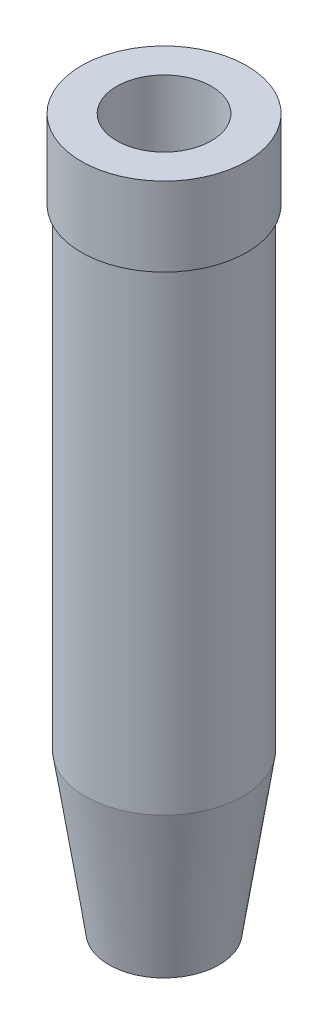
ISO-10303-21;
HEADER;
FILE_DESCRIPTION(('STEP AP214'),'2;1');
FILE_NAME('part.step','',(''),(''),'','','');
FILE_SCHEMA(('AUTOMOTIVE_DESIGN { 1 0 10303 214 1 1 1 1 }'));
ENDSEC;
DATA;
#1=APPLICATION_CONTEXT('core data for automotive mechanical design processes');
#2=APPLICATION_PROTOCOL_DEFINITION('international standard','automotive_design',2000,#1);
#3=PRODUCT_CONTEXT('',#1,'mechanical');
#4=PRODUCT('Part','Part','',(#3));
#5=PRODUCT_RELATED_PRODUCT_CATEGORY('part','',(#4));
#6=PRODUCT_DEFINITION_FORMATION('','',#4);
#7=PRODUCT_DEFINITION_CONTEXT('part definition',#1,'design');
#8=PRODUCT_DEFINITION('design','',#6,#7);
#9=PRODUCT_DEFINITION_SHAPE('','',#8);
#10=(LENGTH_UNIT() NAMED_UNIT(*) SI_UNIT(.MILLI.,.METRE.));
#11=(NAMED_UNIT(*) PLANE_ANGLE_UNIT() SI_UNIT($,.RADIAN.));
#12=(NAMED_UNIT(*) SI_UNIT($,.STERADIAN.) SOLID_ANGLE_UNIT());
#13=UNCERTAINTY_MEASURE_WITH_UNIT(LENGTH_MEASURE(1.E-05),#10,'distance_accuracy_value','');
#14=(GEOMETRIC_REPRESENTATION_CONTEXT(3) GLOBAL_UNCERTAINTY_ASSIGNED_CONTEXT((#13)) GLOBAL_UNIT_ASSIGNED_CONTEXT((#10,
#11,#12)) REPRESENTATION_CONTEXT('',''));
#15=CARTESIAN_POINT('',(0.,0.,0.));
#16=DIRECTION('',(0.,0.,1.));
#17=DIRECTION('',(1.,0.,0.));
#18=AXIS2_PLACEMENT_3D('',#15,#16,#17);
#19=CARTESIAN_POINT('',(3.5,0.,0.));
#20=DIRECTION('',(0.,-1.,0.));
#21=DIRECTION('',(0.,0.,-1.));
#22=AXIS2_PLACEMENT_3D('',#19,#20,#21);
#23=PLANE('',#22);
#24=CARTESIAN_POINT('',(0.,0.,0.));
#25=DIRECTION('',(0.,-1.,0.));
#26=DIRECTION('',(0.,0.,-1.));
#27=AXIS2_PLACEMENT_3D('',#24,#25,#26);
#28=CIRCLE('',#27,3.5);
#29=CARTESIAN_POINT('',(0.,0.,-3.5));
#30=VERTEX_POINT('',#29);
#31=EDGE_CURVE('E70',#30,#30,#28,.T.);
#32=ORIENTED_EDGE('',*,*,#31,.T.);
#33=EDGE_LOOP('',(#32));
#34=FACE_BOUND('',#33,.T.);
#35=CARTESIAN_POINT('',(0.,0.,0.));
#36=DIRECTION('',(0.,-1.,0.));
#37=DIRECTION('',(0.,0.,-1.));
#38=AXIS2_PLACEMENT_3D('',#35,#36,#37);
#39=CIRCLE('',#38,3.);
#40=CARTESIAN_POINT('',(0.,0.,-3.));
#41=VERTEX_POINT('',#40);
#42=EDGE_CURVE('E10',#41,#41,#39,.T.);
#43=ORIENTED_EDGE('',*,*,#42,.F.);
#44=EDGE_LOOP('',(#43));
#45=FACE_BOUND('',#44,.T.);
#46=ADVANCED_FACE('F39',(#34,#45),#23,.T.);
#47=CARTESIAN_POINT('',(0.,0.,0.));
#48=DIRECTION('',(0.,-1.,0.));
#49=DIRECTION('',(0.,0.,-1.));
#50=AXIS2_PLACEMENT_3D('',#47,#48,#49);
#51=CYLINDRICAL_SURFACE('',#50,3.);
#52=ORIENTED_EDGE('',*,*,#42,.T.);
#53=EDGE_LOOP('',(#52));
#54=FACE_BOUND('',#53,.T.);
#55=CARTESIAN_POINT('',(0.,45.,0.));
#56=DIRECTION('',(0.,-1.,0.));
#57=DIRECTION('',(0.,0.,-1.));
#58=AXIS2_PLACEMENT_3D('',#55,#56,#57);
#59=CIRCLE('',#58,3.);
#60=CARTESIAN_POINT('',(0.,45.,-3.));
#61=VERTEX_POINT('',#60);
#62=EDGE_CURVE('E46',#61,#61,#59,.T.);
#63=ORIENTED_EDGE('',*,*,#62,.F.);
#64=EDGE_LOOP('',(#63));
#65=FACE_BOUND('',#64,.T.);
#66=ADVANCED_FACE('F89',(#54,#65),#51,.F.);
#67=CARTESIAN_POINT('',(3.,45.,0.));
#68=DIRECTION('',(0.,1.,0.));
#69=DIRECTION('',(0.,0.,1.));
#70=AXIS2_PLACEMENT_3D('',#67,#68,#69);
#71=PLANE('',#70);
#72=ORIENTED_EDGE('',*,*,#62,.T.);
#73=EDGE_LOOP('',(#72));
#74=FACE_BOUND('',#73,.T.);
#75=CARTESIAN_POINT('',(0.,45.,0.));
#76=DIRECTION('',(0.,-1.,0.));
#77=DIRECTION('',(0.,0.,-1.));
#78=AXIS2_PLACEMENT_3D('',#75,#76,#77);
#79=CIRCLE('',#78,5.25);
#80=CARTESIAN_POINT('',(0.,45.,-5.25));
#81=VERTEX_POINT('',#80);
#82=EDGE_CURVE('E51',#81,#81,#79,.T.);
#83=ORIENTED_EDGE('',*,*,#82,.F.);
#84=EDGE_LOOP('',(#83));
#85=FACE_BOUND('',#84,.T.);
#86=ADVANCED_FACE('F93',(#74,#85),#71,.T.);
#87=CARTESIAN_POINT('',(0.,0.,0.));
#88=DIRECTION('',(0.,-1.,0.));
#89=DIRECTION('',(0.,0.,-1.));
#90=AXIS2_PLACEMENT_3D('',#87,#88,#89);
#91=CYLINDRICAL_SURFACE('',#90,5.25);
#92=ORIENTED_EDGE('',*,*,#82,.T.);
#93=EDGE_LOOP('',(#92));
#94=FACE_BOUND('',#93,.T.);
#95=CARTESIAN_POINT('',(0.,40.,0.));
#96=DIRECTION('',(0.,-1.,0.));
#97=DIRECTION('',(0.,0.,-1.));
#98=AXIS2_PLACEMENT_3D('',#95,#96,#97);
#99=CIRCLE('',#98,5.25);
#100=CARTESIAN_POINT('',(0.,40.,-5.25));
#101=VERTEX_POINT('',#100);
#102=EDGE_CURVE('E56',#101,#101,#99,.T.);
#103=ORIENTED_EDGE('',*,*,#102,.F.);
#104=EDGE_LOOP('',(#103));
#105=FACE_BOUND('',#104,.T.);
#106=ADVANCED_FACE('F97',(#94,#105),#91,.T.);
#107=CARTESIAN_POINT('',(5.25,40.,0.));
#108=DIRECTION('',(0.,-1.,0.));
#109=DIRECTION('',(0.,0.,-1.));
#110=AXIS2_PLACEMENT_3D('',#107,#108,#109);
#111=PLANE('',#110);
#112=ORIENTED_EDGE('',*,*,#102,.T.);
#113=EDGE_LOOP('',(#112));
#114=FACE_BOUND('',#113,.T.);
#115=CARTESIAN_POINT('',(0.,40.,0.));
#116=DIRECTION('',(0.,-1.,0.));
#117=DIRECTION('',(0.,0.,-1.));
#118=AXIS2_PLACEMENT_3D('',#115,#116,#117);
#119=CIRCLE('',#118,5.);
#120=CARTESIAN_POINT('',(0.,40.,-5.));
#121=VERTEX_POINT('',#120);
#122=EDGE_CURVE('E62',#121,#121,#119,.T.);
#123=ORIENTED_EDGE('',*,*,#122,.F.);
#124=EDGE_LOOP('',(#123));
#125=FACE_BOUND('',#124,.T.);
#126=ADVANCED_FACE('F85',(#114,#125),#111,.T.);
#127=CARTESIAN_POINT('',(0.,0.,0.));
#128=DIRECTION('',(0.,-1.,0.));
#129=DIRECTION('',(0.,0.,-1.));
#130=AXIS2_PLACEMENT_3D('',#127,#128,#129);
#131=CYLINDRICAL_SURFACE('',#130,5.);
#132=ORIENTED_EDGE('',*,*,#122,.T.);
#133=EDGE_LOOP('',(#132));
#134=FACE_BOUND('',#133,.T.);
#135=CARTESIAN_POINT('',(0.,10.,0.));
#136=DIRECTION('',(0.,-1.,0.));
#137=DIRECTION('',(0.,0.,-1.));
#138=AXIS2_PLACEMENT_3D('',#135,#136,#137);
#139=CIRCLE('',#138,5.);
#140=CARTESIAN_POINT('',(0.,10.,-5.));
#141=VERTEX_POINT('',#140);
#142=EDGE_CURVE('E66',#141,#141,#139,.T.);
#143=ORIENTED_EDGE('',*,*,#142,.F.);
#144=EDGE_LOOP('',(#143));
#145=FACE_BOUND('',#144,.T.);
#146=ADVANCED_FACE('F79',(#134,#145),#131,.T.);
#147=CARTESIAN_POINT('',(0.,0.,0.));
#148=DIRECTION('',(0.,1.,0.));
#149=DIRECTION('',(0.,0.,1.));
#150=AXIS2_PLACEMENT_3D('',#147,#148,#149);
#151=CONICAL_SURFACE('',#150,3.5,0.148889947609498);
#152=ORIENTED_EDGE('',*,*,#142,.T.);
#153=EDGE_LOOP('',(#152));
#154=FACE_BOUND('',#153,.T.);
#155=ORIENTED_EDGE('',*,*,#31,.F.);
#156=EDGE_LOOP('',(#155));
#157=FACE_BOUND('',#156,.T.);
#158=ADVANCED_FACE('F77',(#154,#157),#151,.T.);
#159=CLOSED_SHELL('',(#46,#66,#86,#106,#126,#146,#158));
#160=MANIFOLD_SOLID_BREP('B2',#159);
#161=ADVANCED_BREP_SHAPE_REPRESENTATION('',(#18,#160),#14);
#162=SHAPE_DEFINITION_REPRESENTATION(#9,#161);
ENDSEC;
END-ISO-10303-21;
